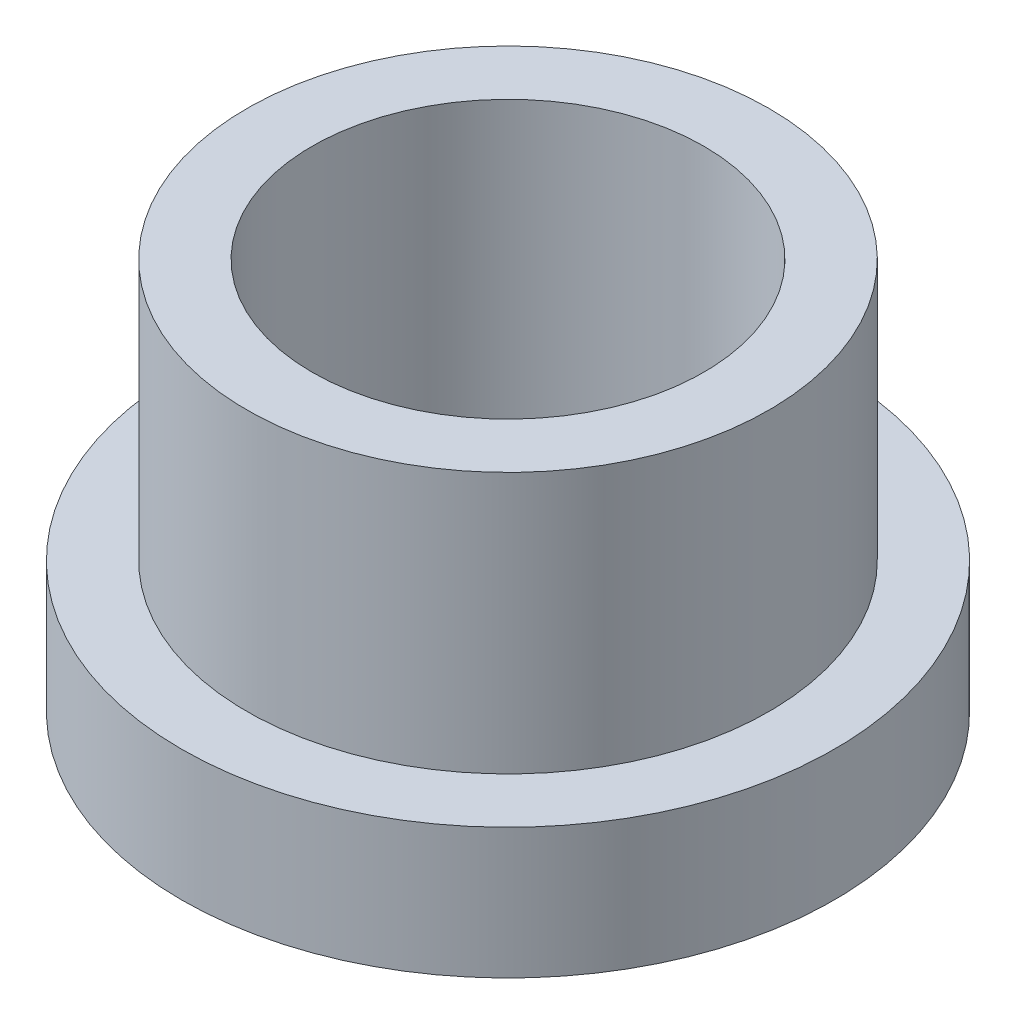
ISO-10303-21;
HEADER;
FILE_DESCRIPTION(('STEP AP214'),'2;1');
FILE_NAME('part.step','',(''),(''),'','','');
FILE_SCHEMA(('AUTOMOTIVE_DESIGN { 1 0 10303 214 1 1 1 1 }'));
ENDSEC;
DATA;
#1=APPLICATION_CONTEXT('core data for automotive mechanical design processes');
#2=APPLICATION_PROTOCOL_DEFINITION('international standard','automotive_design',2000,#1);
#3=PRODUCT_CONTEXT('',#1,'mechanical');
#4=PRODUCT('Part','Part','',(#3));
#5=PRODUCT_RELATED_PRODUCT_CATEGORY('part','',(#4));
#6=PRODUCT_DEFINITION_FORMATION('','',#4);
#7=PRODUCT_DEFINITION_CONTEXT('part definition',#1,'design');
#8=PRODUCT_DEFINITION('design','',#6,#7);
#9=PRODUCT_DEFINITION_SHAPE('','',#8);
#10=(LENGTH_UNIT() NAMED_UNIT(*) SI_UNIT(.MILLI.,.METRE.));
#11=(NAMED_UNIT(*) PLANE_ANGLE_UNIT() SI_UNIT($,.RADIAN.));
#12=(NAMED_UNIT(*) SI_UNIT($,.STERADIAN.) SOLID_ANGLE_UNIT());
#13=UNCERTAINTY_MEASURE_WITH_UNIT(LENGTH_MEASURE(1.E-05),#10,'distance_accuracy_value','');
#14=(GEOMETRIC_REPRESENTATION_CONTEXT(3) GLOBAL_UNCERTAINTY_ASSIGNED_CONTEXT((#13)) GLOBAL_UNIT_ASSIGNED_CONTEXT((#10,
#11,#12)) REPRESENTATION_CONTEXT('',''));
#15=CARTESIAN_POINT('',(0.,0.,0.));
#16=DIRECTION('',(0.,0.,1.));
#17=DIRECTION('',(1.,0.,0.));
#18=AXIS2_PLACEMENT_3D('',#15,#16,#17);
#19=CARTESIAN_POINT('',(0.,3.175,0.));
#20=DIRECTION('',(0.,1.,0.));
#21=DIRECTION('',(0.,0.,1.));
#22=AXIS2_PLACEMENT_3D('',#19,#20,#21);
#23=PLANE('',#22);
#24=CARTESIAN_POINT('',(0.,3.175,0.));
#25=DIRECTION('',(0.,1.,0.));
#26=DIRECTION('',(0.,0.,1.));
#27=AXIS2_PLACEMENT_3D('',#24,#25,#26);
#28=CIRCLE('',#27,7.9375);
#29=CARTESIAN_POINT('',(0.,3.175,7.9375));
#30=VERTEX_POINT('',#29);
#31=EDGE_CURVE('E11',#30,#30,#28,.T.);
#32=ORIENTED_EDGE('',*,*,#31,.T.);
#33=EDGE_LOOP('',(#32));
#34=FACE_BOUND('',#33,.T.);
#35=CARTESIAN_POINT('',(0.,3.175,0.));
#36=DIRECTION('',(0.,1.,0.));
#37=DIRECTION('',(0.,0.,1.));
#38=AXIS2_PLACEMENT_3D('',#35,#36,#37);
#39=CIRCLE('',#38,6.35);
#40=CARTESIAN_POINT('',(0.,3.175,-6.35));
#41=VERTEX_POINT('',#40);
#42=EDGE_CURVE('E49',#41,#41,#39,.T.);
#43=ORIENTED_EDGE('',*,*,#42,.F.);
#44=EDGE_LOOP('',(#43));
#45=FACE_BOUND('',#44,.T.);
#46=ADVANCED_FACE('F34',(#34,#45),#23,.T.);
#47=CARTESIAN_POINT('',(0.,3.175,0.));
#48=DIRECTION('',(0.,-1.,0.));
#49=DIRECTION('',(0.,0.,-1.));
#50=AXIS2_PLACEMENT_3D('',#47,#48,#49);
#51=CYLINDRICAL_SURFACE('',#50,7.9375);
#52=ORIENTED_EDGE('',*,*,#31,.F.);
#53=EDGE_LOOP('',(#52));
#54=FACE_BOUND('',#53,.T.);
#55=CARTESIAN_POINT('',(0.,0.,0.));
#56=DIRECTION('',(0.,1.,0.));
#57=DIRECTION('',(0.,0.,1.));
#58=AXIS2_PLACEMENT_3D('',#55,#56,#57);
#59=CIRCLE('',#58,7.9375);
#60=CARTESIAN_POINT('',(0.,0.,7.9375));
#61=VERTEX_POINT('',#60);
#62=EDGE_CURVE('E38',#61,#61,#59,.T.);
#63=ORIENTED_EDGE('',*,*,#62,.T.);
#64=EDGE_LOOP('',(#63));
#65=FACE_BOUND('',#64,.T.);
#66=ADVANCED_FACE('F36',(#54,#65),#51,.T.);
#67=CARTESIAN_POINT('',(0.,0.,0.));
#68=DIRECTION('',(0.,1.,0.));
#69=DIRECTION('',(0.,0.,1.));
#70=AXIS2_PLACEMENT_3D('',#67,#68,#69);
#71=PLANE('',#70);
#72=CARTESIAN_POINT('',(0.,0.,0.));
#73=DIRECTION('',(0.,1.,0.));
#74=DIRECTION('',(0.,0.,1.));
#75=AXIS2_PLACEMENT_3D('',#72,#73,#74);
#76=CIRCLE('',#75,4.7625);
#77=CARTESIAN_POINT('',(0.,0.,4.7625));
#78=VERTEX_POINT('',#77);
#79=EDGE_CURVE('E52',#78,#78,#76,.T.);
#80=ORIENTED_EDGE('',*,*,#79,.T.);
#81=EDGE_LOOP('',(#80));
#82=FACE_BOUND('',#81,.T.);
#83=ORIENTED_EDGE('',*,*,#62,.F.);
#84=EDGE_LOOP('',(#83));
#85=FACE_BOUND('',#84,.T.);
#86=ADVANCED_FACE('F59',(#82,#85),#71,.F.);
#87=CARTESIAN_POINT('',(0.,37.0105122421383,0.));
#88=DIRECTION('',(0.,-1.,0.));
#89=DIRECTION('',(0.,0.,-1.));
#90=AXIS2_PLACEMENT_3D('',#87,#88,#89);
#91=CYLINDRICAL_SURFACE('',#90,6.35);
#92=CARTESIAN_POINT('',(0.,9.525,0.));
#93=DIRECTION('',(0.,1.,0.));
#94=DIRECTION('',(0.,0.,1.));
#95=AXIS2_PLACEMENT_3D('',#92,#93,#94);
#96=CIRCLE('',#95,6.35);
#97=CARTESIAN_POINT('',(0.,9.525,-6.35));
#98=VERTEX_POINT('',#97);
#99=EDGE_CURVE('E45',#98,#98,#96,.T.);
#100=CARTESIAN_POINT('',(0.,3.175,-6.35));
#101=CARTESIAN_POINT('',(0.,3.24114583333334,-6.35));
#102=CARTESIAN_POINT('',(0.,3.30729166666667,-6.35));
#103=CARTESIAN_POINT('',(0.,3.43958333333334,-6.35));
#104=CARTESIAN_POINT('',(0.,3.50572916666667,-6.35));
#105=CARTESIAN_POINT('',(0.,3.63802083333334,-6.35));
#106=CARTESIAN_POINT('',(0.,3.70416666666667,-6.35));
#107=CARTESIAN_POINT('',(0.,3.83645833333334,-6.35));
#108=CARTESIAN_POINT('',(0.,3.90260416666667,-6.35));
#109=CARTESIAN_POINT('',(0.,4.03489583333333,-6.35));
#110=CARTESIAN_POINT('',(0.,4.10104166666667,-6.35));
#111=CARTESIAN_POINT('',(0.,4.23333333333334,-6.35));
#112=CARTESIAN_POINT('',(0.,4.29947916666667,-6.35));
#113=CARTESIAN_POINT('',(0.,4.43177083333334,-6.35));
#114=CARTESIAN_POINT('',(0.,4.49791666666667,-6.35));
#115=CARTESIAN_POINT('',(0.,4.63020833333333,-6.35));
#116=CARTESIAN_POINT('',(0.,4.69635416666667,-6.35));
#117=CARTESIAN_POINT('',(0.,4.82864583333334,-6.35));
#118=CARTESIAN_POINT('',(0.,4.89479166666667,-6.35));
#119=CARTESIAN_POINT('',(0.,5.02708333333334,-6.35));
#120=CARTESIAN_POINT('',(0.,5.09322916666667,-6.35));
#121=CARTESIAN_POINT('',(0.,5.22552083333333,-6.35));
#122=CARTESIAN_POINT('',(0.,5.29166666666667,-6.35));
#123=CARTESIAN_POINT('',(0.,5.42395833333334,-6.35));
#124=CARTESIAN_POINT('',(0.,5.49010416666667,-6.35));
#125=CARTESIAN_POINT('',(0.,5.62239583333334,-6.35));
#126=CARTESIAN_POINT('',(0.,5.68854166666667,-6.35));
#127=CARTESIAN_POINT('',(0.,5.82083333333333,-6.35));
#128=CARTESIAN_POINT('',(0.,5.88697916666667,-6.35));
#129=CARTESIAN_POINT('',(0.,6.01927083333333,-6.35));
#130=CARTESIAN_POINT('',(0.,6.08541666666667,-6.35));
#131=CARTESIAN_POINT('',(0.,6.21770833333333,-6.35));
#132=CARTESIAN_POINT('',(0.,6.28385416666667,-6.35));
#133=CARTESIAN_POINT('',(0.,6.41614583333333,-6.35));
#134=CARTESIAN_POINT('',(0.,6.48229166666666,-6.35));
#135=CARTESIAN_POINT('',(0.,6.61458333333333,-6.35));
#136=CARTESIAN_POINT('',(0.,6.68072916666666,-6.35));
#137=CARTESIAN_POINT('',(0.,6.81302083333333,-6.35));
#138=CARTESIAN_POINT('',(0.,6.87916666666666,-6.35));
#139=CARTESIAN_POINT('',(0.,7.01145833333333,-6.35));
#140=CARTESIAN_POINT('',(0.,7.07760416666666,-6.35));
#141=CARTESIAN_POINT('',(0.,7.20989583333333,-6.35));
#142=CARTESIAN_POINT('',(0.,7.27604166666666,-6.35));
#143=CARTESIAN_POINT('',(0.,7.40833333333333,-6.35));
#144=CARTESIAN_POINT('',(0.,7.47447916666667,-6.35));
#145=CARTESIAN_POINT('',(0.,7.60677083333333,-6.35));
#146=CARTESIAN_POINT('',(0.,7.67291666666666,-6.35));
#147=CARTESIAN_POINT('',(0.,7.80520833333333,-6.35));
#148=CARTESIAN_POINT('',(0.,7.87135416666666,-6.35));
#149=CARTESIAN_POINT('',(0.,8.00364583333333,-6.35));
#150=CARTESIAN_POINT('',(0.,8.06979166666666,-6.35));
#151=CARTESIAN_POINT('',(0.,8.20208333333333,-6.35));
#152=CARTESIAN_POINT('',(0.,8.26822916666666,-6.35));
#153=CARTESIAN_POINT('',(0.,8.40052083333333,-6.35));
#154=CARTESIAN_POINT('',(0.,8.46666666666666,-6.35));
#155=CARTESIAN_POINT('',(0.,8.59895833333333,-6.35));
#156=CARTESIAN_POINT('',(0.,8.66510416666666,-6.35));
#157=CARTESIAN_POINT('',(0.,8.79739583333333,-6.35));
#158=CARTESIAN_POINT('',(0.,8.86354166666666,-6.35));
#159=CARTESIAN_POINT('',(0.,8.99583333333333,-6.35));
#160=CARTESIAN_POINT('',(0.,9.06197916666666,-6.35));
#161=CARTESIAN_POINT('',(0.,9.19427083333333,-6.35));
#162=CARTESIAN_POINT('',(0.,9.26041666666666,-6.35));
#163=CARTESIAN_POINT('',(0.,9.39270833333333,-6.35));
#164=CARTESIAN_POINT('',(0.,9.45885416666666,-6.35));
#165=CARTESIAN_POINT('',(0.,9.525,-6.35));
#166=B_SPLINE_CURVE_WITH_KNOTS('',3,(#100,#101,#102,#103,#104,#105,#106,#107,#108,#109,#110,
#111,#112,#113,#114,#115,#116,#117,#118,#119,#120,#121,#122,#123,#124,#125,#126,#127,#128,#129,
#130,#131,#132,#133,#134,#135,#136,#137,#138,#139,#140,#141,#142,#143,#144,#145,#146,#147,#148,
#149,#150,#151,#152,#153,#154,#155,#156,#157,#158,#159,#160,#161,#162,#163,#164,#165),
.UNSPECIFIED.,.F.,.F.,(4,2,2,2,2,2,2,2,2,2,2,2,2,2,2,2,2,2,2,2,2,2,2,2,2,2,2,2,2,2,2,2,4),(0.,
0.198437500000002,0.396874999999998,0.5953125,0.793749999999996,0.992187499999998,1.190625,
1.3890625,1.5875,1.7859375,1.984375,2.1828125,2.38125,2.5796875,2.778125,2.97656249999999,
3.17499999999999,3.37343749999999,3.57187499999999,3.77031249999999,3.96874999999999,
4.16718749999999,4.36562499999999,4.56406249999999,4.76249999999999,4.96093749999999,
5.15937499999999,5.35781249999999,5.55624999999999,5.75468749999999,5.95312499999999,
6.15156249999999,6.34999999999999),.UNSPECIFIED.);
#167=EDGE_CURVE('BSEAM71',#41,#98,#166,.T.);
#168=ORIENTED_EDGE('',*,*,#42,.T.);
#169=ORIENTED_EDGE('',*,*,#99,.F.);
#170=ORIENTED_EDGE('',*,*,#167,.T.);
#171=ORIENTED_EDGE('',*,*,#167,.F.);
#172=EDGE_LOOP('',(#168,#170,#169,#171));
#173=FACE_BOUND('',#172,.T.);
#174=ADVANCED_FACE('F71',(#173),#91,.T.);
#175=CARTESIAN_POINT('',(0.,9.525,0.));
#176=DIRECTION('',(0.,1.,0.));
#177=DIRECTION('',(0.,0.,1.));
#178=AXIS2_PLACEMENT_3D('',#175,#176,#177);
#179=PLANE('',#178);
#180=CARTESIAN_POINT('',(0.,9.525,0.));
#181=DIRECTION('',(0.,1.,0.));
#182=DIRECTION('',(0.,0.,1.));
#183=AXIS2_PLACEMENT_3D('',#180,#181,#182);
#184=CIRCLE('',#183,4.7625);
#185=CARTESIAN_POINT('',(0.,9.525,4.7625));
#186=VERTEX_POINT('',#185);
#187=EDGE_CURVE('E53',#186,#186,#184,.T.);
#188=ORIENTED_EDGE('',*,*,#187,.F.);
#189=EDGE_LOOP('',(#188));
#190=FACE_BOUND('',#189,.T.);
#191=ORIENTED_EDGE('',*,*,#99,.T.);
#192=EDGE_LOOP('',(#191));
#193=FACE_BOUND('',#192,.T.);
#194=ADVANCED_FACE('F65',(#190,#193),#179,.T.);
#195=CARTESIAN_POINT('',(0.,0.,0.));
#196=DIRECTION('',(0.,1.,0.));
#197=DIRECTION('',(0.,0.,1.));
#198=AXIS2_PLACEMENT_3D('',#195,#196,#197);
#199=CYLINDRICAL_SURFACE('',#198,4.7625);
#200=CARTESIAN_POINT('',(0.,0.,4.7625));
#201=CARTESIAN_POINT('',(0.,0.0992187499999999,4.7625));
#202=CARTESIAN_POINT('',(0.,0.1984375,4.7625));
#203=CARTESIAN_POINT('',(0.,0.396875,4.7625));
#204=CARTESIAN_POINT('',(0.,0.49609375,4.7625));
#205=CARTESIAN_POINT('',(0.,0.69453125,4.7625));
#206=CARTESIAN_POINT('',(0.,0.79375,4.7625));
#207=CARTESIAN_POINT('',(0.,0.9921875,4.7625));
#208=CARTESIAN_POINT('',(0.,1.09140625,4.7625));
#209=CARTESIAN_POINT('',(0.,1.28984375,4.7625));
#210=CARTESIAN_POINT('',(0.,1.3890625,4.7625));
#211=CARTESIAN_POINT('',(0.,1.5875,4.7625));
#212=CARTESIAN_POINT('',(0.,1.68671875,4.7625));
#213=CARTESIAN_POINT('',(0.,1.88515625,4.7625));
#214=CARTESIAN_POINT('',(0.,1.984375,4.7625));
#215=CARTESIAN_POINT('',(0.,2.1828125,4.7625));
#216=CARTESIAN_POINT('',(0.,2.28203125,4.7625));
#217=CARTESIAN_POINT('',(0.,2.48046875,4.7625));
#218=CARTESIAN_POINT('',(0.,2.5796875,4.7625));
#219=CARTESIAN_POINT('',(0.,2.778125,4.7625));
#220=CARTESIAN_POINT('',(0.,2.87734375,4.7625));
#221=CARTESIAN_POINT('',(0.,3.07578125,4.7625));
#222=CARTESIAN_POINT('',(0.,3.175,4.7625));
#223=CARTESIAN_POINT('',(0.,3.3734375,4.7625));
#224=CARTESIAN_POINT('',(0.,3.47265625,4.7625));
#225=CARTESIAN_POINT('',(0.,3.67109375,4.7625));
#226=CARTESIAN_POINT('',(0.,3.7703125,4.7625));
#227=CARTESIAN_POINT('',(0.,3.96875,4.7625));
#228=CARTESIAN_POINT('',(0.,4.06796875,4.7625));
#229=CARTESIAN_POINT('',(0.,4.26640625,4.7625));
#230=CARTESIAN_POINT('',(0.,4.365625,4.7625));
#231=CARTESIAN_POINT('',(0.,4.5640625,4.7625));
#232=CARTESIAN_POINT('',(0.,4.66328125,4.7625));
#233=CARTESIAN_POINT('',(0.,4.86171875,4.7625));
#234=CARTESIAN_POINT('',(0.,4.9609375,4.7625));
#235=CARTESIAN_POINT('',(0.,5.159375,4.7625));
#236=CARTESIAN_POINT('',(0.,5.25859375,4.7625));
#237=CARTESIAN_POINT('',(0.,5.45703125,4.7625));
#238=CARTESIAN_POINT('',(0.,5.55625,4.7625));
#239=CARTESIAN_POINT('',(0.,5.7546875,4.7625));
#240=CARTESIAN_POINT('',(0.,5.85390625,4.7625));
#241=CARTESIAN_POINT('',(0.,6.05234375,4.7625));
#242=CARTESIAN_POINT('',(0.,6.1515625,4.7625));
#243=CARTESIAN_POINT('',(0.,6.35,4.7625));
#244=CARTESIAN_POINT('',(0.,6.44921875,4.7625));
#245=CARTESIAN_POINT('',(0.,6.64765625,4.7625));
#246=CARTESIAN_POINT('',(0.,6.746875,4.7625));
#247=CARTESIAN_POINT('',(0.,6.9453125,4.7625));
#248=CARTESIAN_POINT('',(0.,7.04453125,4.7625));
#249=CARTESIAN_POINT('',(0.,7.24296875,4.7625));
#250=CARTESIAN_POINT('',(0.,7.3421875,4.7625));
#251=CARTESIAN_POINT('',(0.,7.540625,4.7625));
#252=CARTESIAN_POINT('',(0.,7.63984375,4.7625));
#253=CARTESIAN_POINT('',(0.,7.83828125,4.7625));
#254=CARTESIAN_POINT('',(0.,7.9375,4.7625));
#255=CARTESIAN_POINT('',(0.,8.1359375,4.7625));
#256=CARTESIAN_POINT('',(0.,8.23515625,4.7625));
#257=CARTESIAN_POINT('',(0.,8.43359375,4.7625));
#258=CARTESIAN_POINT('',(0.,8.5328125,4.7625));
#259=CARTESIAN_POINT('',(0.,8.73125,4.7625));
#260=CARTESIAN_POINT('',(0.,8.83046875,4.7625));
#261=CARTESIAN_POINT('',(0.,9.02890625,4.7625));
#262=CARTESIAN_POINT('',(0.,9.128125,4.7625));
#263=CARTESIAN_POINT('',(0.,9.3265625,4.7625));
#264=CARTESIAN_POINT('',(0.,9.42578125,4.7625));
#265=CARTESIAN_POINT('',(0.,9.525,4.7625));
#266=B_SPLINE_CURVE_WITH_KNOTS('',3,(#200,#201,#202,#203,#204,#205,#206,#207,#208,#209,#210,
#211,#212,#213,#214,#215,#216,#217,#218,#219,#220,#221,#222,#223,#224,#225,#226,#227,#228,#229,
#230,#231,#232,#233,#234,#235,#236,#237,#238,#239,#240,#241,#242,#243,#244,#245,#246,#247,#248,
#249,#250,#251,#252,#253,#254,#255,#256,#257,#258,#259,#260,#261,#262,#263,#264,#265),
.UNSPECIFIED.,.F.,.F.,(4,2,2,2,2,2,2,2,2,2,2,2,2,2,2,2,2,2,2,2,2,2,2,2,2,2,2,2,2,2,2,2,4),(0.,
0.29765625,0.5953125,0.89296875,1.190625,1.48828125,1.7859375,2.08359375,2.38125,2.67890625,
2.9765625,3.27421875,3.571875,3.86953125,4.1671875,4.46484375,4.7625,5.06015625,5.3578125,
5.65546875,5.953125,6.25078125,6.5484375,6.84609375,7.14375,7.44140625,7.7390625,8.03671875,
8.334375,8.63203125,8.9296875,9.22734375,9.525),.UNSPECIFIED.);
#267=EDGE_CURVE('BSEAM62',#78,#186,#266,.T.);
#268=ORIENTED_EDGE('',*,*,#79,.F.);
#269=ORIENTED_EDGE('',*,*,#187,.T.);
#270=ORIENTED_EDGE('',*,*,#267,.T.);
#271=ORIENTED_EDGE('',*,*,#267,.F.);
#272=EDGE_LOOP('',(#268,#270,#269,#271));
#273=FACE_BOUND('',#272,.T.);
#274=ADVANCED_FACE('F62',(#273),#199,.F.);
#275=CLOSED_SHELL('',(#46,#66,#86,#174,#194,#274));
#276=MANIFOLD_SOLID_BREP('B2',#275);
#277=ADVANCED_BREP_SHAPE_REPRESENTATION('',(#18,#276),#14);
#278=SHAPE_DEFINITION_REPRESENTATION(#9,#277);
ENDSEC;
END-ISO-10303-21;
